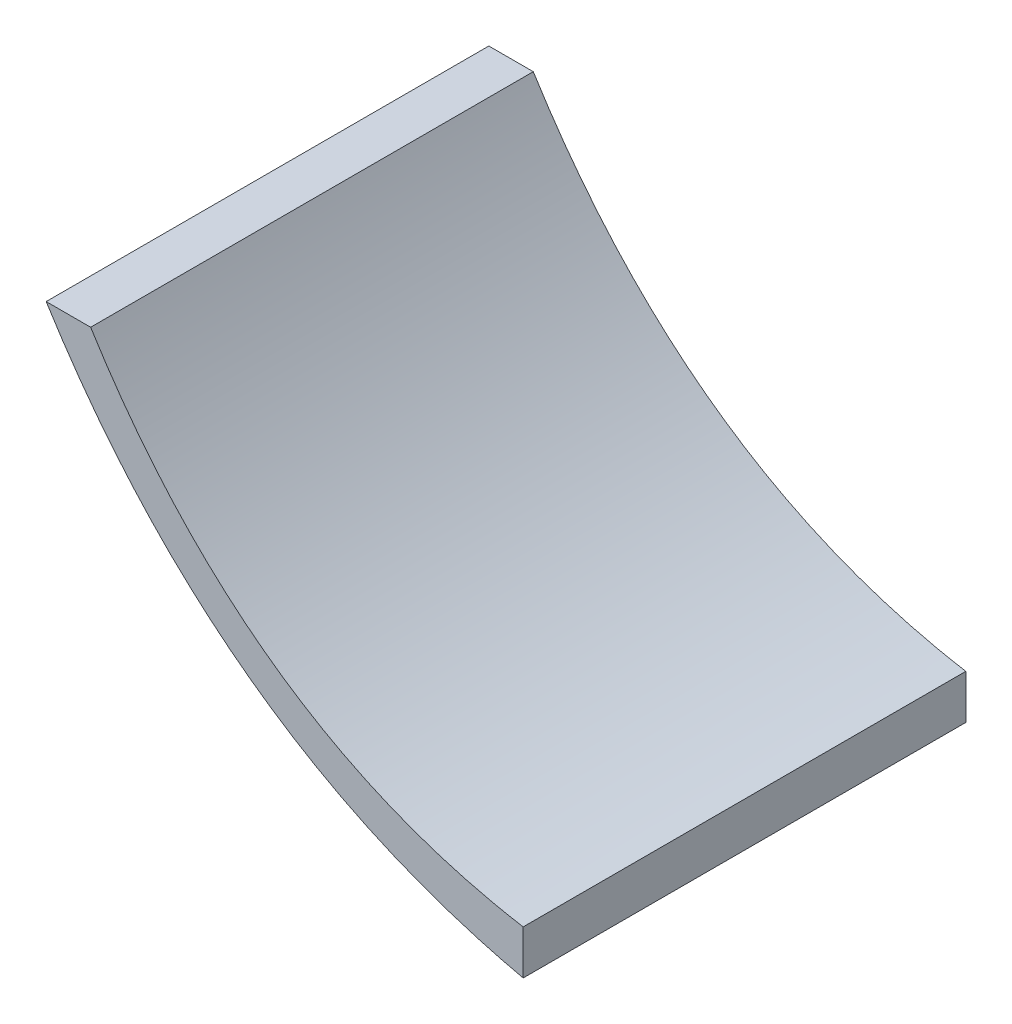
ISO-10303-21;
HEADER;
FILE_DESCRIPTION(('STEP AP214'),'2;1');
FILE_NAME('part.step','',(''),(''),'','','');
FILE_SCHEMA(('AUTOMOTIVE_DESIGN { 1 0 10303 214 1 1 1 1 }'));
ENDSEC;
DATA;
#1=APPLICATION_CONTEXT('core data for automotive mechanical design processes');
#2=APPLICATION_PROTOCOL_DEFINITION('international standard','automotive_design',2000,#1);
#3=PRODUCT_CONTEXT('',#1,'mechanical');
#4=PRODUCT('Part','Part','',(#3));
#5=PRODUCT_RELATED_PRODUCT_CATEGORY('part','',(#4));
#6=PRODUCT_DEFINITION_FORMATION('','',#4);
#7=PRODUCT_DEFINITION_CONTEXT('part definition',#1,'design');
#8=PRODUCT_DEFINITION('design','',#6,#7);
#9=PRODUCT_DEFINITION_SHAPE('','',#8);
#10=(LENGTH_UNIT() NAMED_UNIT(*) SI_UNIT(.MILLI.,.METRE.));
#11=(NAMED_UNIT(*) PLANE_ANGLE_UNIT() SI_UNIT($,.RADIAN.));
#12=(NAMED_UNIT(*) SI_UNIT($,.STERADIAN.) SOLID_ANGLE_UNIT());
#13=UNCERTAINTY_MEASURE_WITH_UNIT(LENGTH_MEASURE(1.E-05),#10,'distance_accuracy_value','');
#14=(GEOMETRIC_REPRESENTATION_CONTEXT(3) GLOBAL_UNCERTAINTY_ASSIGNED_CONTEXT((#13)) GLOBAL_UNIT_ASSIGNED_CONTEXT((#10,
#11,#12)) REPRESENTATION_CONTEXT('',''));
#15=CARTESIAN_POINT('',(0.,0.,0.));
#16=DIRECTION('',(0.,0.,1.));
#17=DIRECTION('',(1.,0.,0.));
#18=AXIS2_PLACEMENT_3D('',#15,#16,#17);
#19=CARTESIAN_POINT('',(-124.100884520454,84.2637509276027,63.5));
#20=DIRECTION('',(0.,-1.,0.));
#21=DIRECTION('',(0.,0.,-1.));
#22=AXIS2_PLACEMENT_3D('',#19,#20,#21);
#23=PLANE('',#22);
#24=DIRECTION('',(-1.,0.,0.));
#25=VECTOR('',#24,1.);
#26=CARTESIAN_POINT('',(-124.100884520454,84.2637509276027,-63.5));
#27=LINE('',#26,#25);
#28=CARTESIAN_POINT('',(-124.100884520454,84.2637509276027,-63.5));
#29=VERTEX_POINT('',#28);
#30=CARTESIAN_POINT('',(-136.857511414966,84.2637509276027,-63.5));
#31=VERTEX_POINT('',#30);
#32=EDGE_CURVE('E104',#29,#31,#27,.T.);
#33=ORIENTED_EDGE('',*,*,#32,.T.);
#34=DIRECTION('',(0.,0.,-1.));
#35=VECTOR('',#34,1.);
#36=CARTESIAN_POINT('',(-136.857511414966,84.2637509276027,63.5));
#37=LINE('',#36,#35);
#38=CARTESIAN_POINT('',(-136.857511414966,84.2637509276027,63.5));
#39=VERTEX_POINT('',#38);
#40=EDGE_CURVE('E11',#39,#31,#37,.T.);
#41=ORIENTED_EDGE('',*,*,#40,.F.);
#42=DIRECTION('',(-1.,0.,0.));
#43=VECTOR('',#42,1.);
#44=CARTESIAN_POINT('',(-124.100884520454,84.2637509276027,63.5));
#45=LINE('',#44,#43);
#46=CARTESIAN_POINT('',(-124.100884520454,84.2637509276027,63.5));
#47=VERTEX_POINT('',#46);
#48=EDGE_CURVE('E84',#47,#39,#45,.T.);
#49=ORIENTED_EDGE('',*,*,#48,.F.);
#50=DIRECTION('',(0.,0.,-1.));
#51=VECTOR('',#50,1.);
#52=CARTESIAN_POINT('',(-124.100884520454,84.2637509276027,63.5));
#53=LINE('',#52,#51);
#54=EDGE_CURVE('E51',#47,#29,#53,.T.);
#55=ORIENTED_EDGE('',*,*,#54,.T.);
#56=EDGE_LOOP('',(#33,#41,#49,#55));
#57=FACE_BOUND('',#56,.T.);
#58=ADVANCED_FACE('F35',(#57),#23,.F.);
#59=CARTESIAN_POINT('',(-136.857511414966,84.2637509276027,63.5));
#60=CARTESIAN_POINT('',(-86.8571467874485,4.12644419848638,63.5));
#61=CARTESIAN_POINT('',(0.,-15.3818259418301,63.5));
#62=B_SPLINE_CURVE_WITH_KNOTS('',2,(#59,#60,#61),.UNSPECIFIED.,.F.,.F.,(3,3),(0.,1.),.UNSPECIFIED.);
#63=DIRECTION('',(0.,0.,-1.));
#64=VECTOR('',#63,1.);
#65=SURFACE_OF_LINEAR_EXTRUSION('',#62,#64);
#66=CARTESIAN_POINT('',(-136.857511414966,84.2637509276027,-63.5));
#67=CARTESIAN_POINT('',(-86.8571467874485,4.12644419848638,-63.5));
#68=CARTESIAN_POINT('',(0.,-15.3818259418301,-63.5));
#69=B_SPLINE_CURVE_WITH_KNOTS('',2,(#66,#67,#68),.UNSPECIFIED.,.F.,.F.,(3,3),(0.,1.),.UNSPECIFIED.);
#70=CARTESIAN_POINT('',(0.,-15.3818259418301,-63.5));
#71=VERTEX_POINT('',#70);
#72=EDGE_CURVE('E89',#31,#71,#69,.T.);
#73=ORIENTED_EDGE('',*,*,#72,.T.);
#74=DIRECTION('',(0.,0.,-1.));
#75=VECTOR('',#74,1.);
#76=CARTESIAN_POINT('',(0.,-15.3818259418301,63.5));
#77=LINE('',#76,#75);
#78=CARTESIAN_POINT('',(0.,-15.3818259418301,63.5));
#79=VERTEX_POINT('',#78);
#80=EDGE_CURVE('E43',#79,#71,#77,.T.);
#81=ORIENTED_EDGE('',*,*,#80,.F.);
#82=EDGE_CURVE('E77',#39,#79,#62,.T.);
#83=ORIENTED_EDGE('',*,*,#82,.F.);
#84=ORIENTED_EDGE('',*,*,#40,.T.);
#85=EDGE_LOOP('',(#73,#81,#83,#84));
#86=FACE_BOUND('',#85,.T.);
#87=ADVANCED_FACE('F88',(#86),#65,.F.);
#88=CARTESIAN_POINT('',(0.,-15.3818259418301,63.5));
#89=DIRECTION('',(-1.,0.,0.));
#90=DIRECTION('',(0.,0.,1.));
#91=AXIS2_PLACEMENT_3D('',#88,#89,#90);
#92=PLANE('',#91);
#93=DIRECTION('',(0.,1.,0.));
#94=VECTOR('',#93,1.);
#95=CARTESIAN_POINT('',(0.,-15.3818259418301,-63.5));
#96=LINE('',#95,#94);
#97=CARTESIAN_POINT('',(0.,-2.68182594183013,-63.5));
#98=VERTEX_POINT('',#97);
#99=EDGE_CURVE('E125',#71,#98,#96,.T.);
#100=ORIENTED_EDGE('',*,*,#99,.T.);
#101=DIRECTION('',(0.,0.,-1.));
#102=VECTOR('',#101,1.);
#103=CARTESIAN_POINT('',(0.,-2.68182594183013,63.5));
#104=LINE('',#103,#102);
#105=CARTESIAN_POINT('',(0.,-2.68182594183013,63.5));
#106=VERTEX_POINT('',#105);
#107=EDGE_CURVE('E66',#106,#98,#104,.T.);
#108=ORIENTED_EDGE('',*,*,#107,.F.);
#109=DIRECTION('',(0.,1.,0.));
#110=VECTOR('',#109,1.);
#111=CARTESIAN_POINT('',(0.,-15.3818259418301,63.5));
#112=LINE('',#111,#110);
#113=EDGE_CURVE('E83',#79,#106,#112,.T.);
#114=ORIENTED_EDGE('',*,*,#113,.F.);
#115=ORIENTED_EDGE('',*,*,#80,.T.);
#116=EDGE_LOOP('',(#100,#108,#114,#115));
#117=FACE_BOUND('',#116,.T.);
#118=ADVANCED_FACE('F92',(#117),#92,.F.);
#119=CARTESIAN_POINT('',(-124.100884520454,84.2637509276027,63.5));
#120=CARTESIAN_POINT('',(-78.3169619727716,10.6579551327481,63.5));
#121=CARTESIAN_POINT('',(0.,-2.68182594183013,63.5));
#122=B_SPLINE_CURVE_WITH_KNOTS('',2,(#119,#120,#121),.UNSPECIFIED.,.F.,.F.,(3,3),(0.,1.),.UNSPECIFIED.);
#123=DIRECTION('',(0.,0.,-1.));
#124=VECTOR('',#123,1.);
#125=SURFACE_OF_LINEAR_EXTRUSION('',#122,#124);
#126=CARTESIAN_POINT('',(-124.100884520454,84.2637509276027,-63.5));
#127=CARTESIAN_POINT('',(-78.3169619727716,10.6579551327481,-63.5));
#128=CARTESIAN_POINT('',(0.,-2.68182594183013,-63.5));
#129=B_SPLINE_CURVE_WITH_KNOTS('',2,(#126,#127,#128),.UNSPECIFIED.,.F.,.F.,(3,3),(0.,1.),.UNSPECIFIED.);
#130=EDGE_CURVE('E126',#29,#98,#129,.T.);
#131=ORIENTED_EDGE('',*,*,#130,.F.);
#132=ORIENTED_EDGE('',*,*,#54,.F.);
#133=EDGE_CURVE('E93',#47,#106,#122,.T.);
#134=ORIENTED_EDGE('',*,*,#133,.T.);
#135=ORIENTED_EDGE('',*,*,#107,.T.);
#136=EDGE_LOOP('',(#131,#132,#134,#135));
#137=FACE_BOUND('',#136,.T.);
#138=ADVANCED_FACE('F110',(#137),#125,.T.);
#139=CARTESIAN_POINT('',(-77.6429512474658,19.2837033456863,63.5));
#140=DIRECTION('',(0.,0.,-1.));
#141=DIRECTION('',(-1.,0.,0.));
#142=AXIS2_PLACEMENT_3D('',#139,#140,#141);
#143=PLANE('',#142);
#144=ORIENTED_EDGE('',*,*,#48,.T.);
#145=ORIENTED_EDGE('',*,*,#82,.T.);
#146=ORIENTED_EDGE('',*,*,#113,.T.);
#147=ORIENTED_EDGE('',*,*,#133,.F.);
#148=EDGE_LOOP('',(#144,#145,#146,#147));
#149=FACE_BOUND('',#148,.T.);
#150=ADVANCED_FACE('F80',(#149),#143,.F.);
#151=CARTESIAN_POINT('',(-77.6429512474658,19.2837033456863,-63.5));
#152=DIRECTION('',(0.,0.,-1.));
#153=DIRECTION('',(-1.,0.,0.));
#154=AXIS2_PLACEMENT_3D('',#151,#152,#153);
#155=PLANE('',#154);
#156=ORIENTED_EDGE('',*,*,#32,.F.);
#157=ORIENTED_EDGE('',*,*,#130,.T.);
#158=ORIENTED_EDGE('',*,*,#99,.F.);
#159=ORIENTED_EDGE('',*,*,#72,.F.);
#160=EDGE_LOOP('',(#156,#157,#158,#159));
#161=FACE_BOUND('',#160,.T.);
#162=ADVANCED_FACE('F114',(#161),#155,.T.);
#163=CLOSED_SHELL('',(#58,#87,#118,#138,#150,#162));
#164=MANIFOLD_SOLID_BREP('B2',#163);
#165=ADVANCED_BREP_SHAPE_REPRESENTATION('',(#18,#164),#14);
#166=SHAPE_DEFINITION_REPRESENTATION(#9,#165);
ENDSEC;
END-ISO-10303-21;
